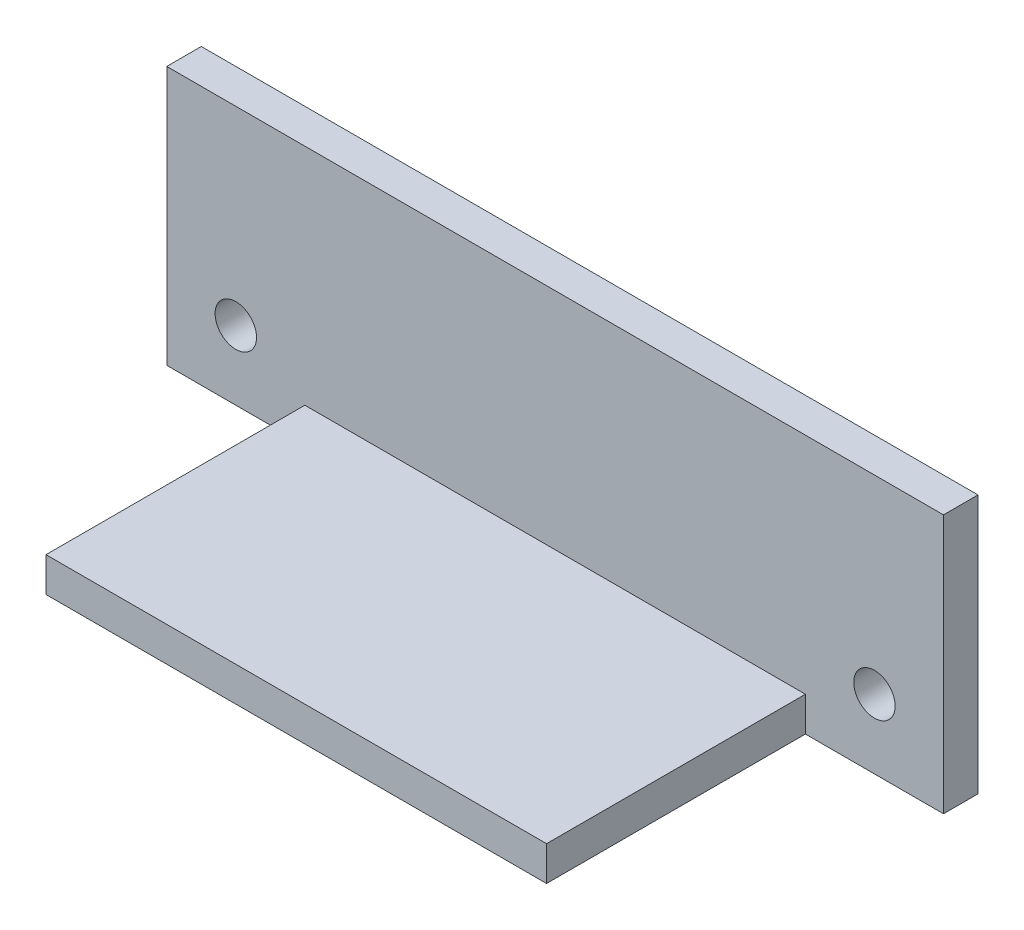
ISO-10303-21;
HEADER;
FILE_DESCRIPTION(('STEP AP214'),'2;1');
FILE_NAME('part.step','',(''),(''),'','','');
FILE_SCHEMA(('AUTOMOTIVE_DESIGN { 1 0 10303 214 1 1 1 1 }'));
ENDSEC;
DATA;
#1=APPLICATION_CONTEXT('core data for automotive mechanical design processes');
#2=APPLICATION_PROTOCOL_DEFINITION('international standard','automotive_design',2000,#1);
#3=PRODUCT_CONTEXT('',#1,'mechanical');
#4=PRODUCT('Part','Part','',(#3));
#5=PRODUCT_RELATED_PRODUCT_CATEGORY('part','',(#4));
#6=PRODUCT_DEFINITION_FORMATION('','',#4);
#7=PRODUCT_DEFINITION_CONTEXT('part definition',#1,'design');
#8=PRODUCT_DEFINITION('design','',#6,#7);
#9=PRODUCT_DEFINITION_SHAPE('','',#8);
#10=(LENGTH_UNIT() NAMED_UNIT(*) SI_UNIT(.MILLI.,.METRE.));
#11=(NAMED_UNIT(*) PLANE_ANGLE_UNIT() SI_UNIT($,.RADIAN.));
#12=(NAMED_UNIT(*) SI_UNIT($,.STERADIAN.) SOLID_ANGLE_UNIT());
#13=UNCERTAINTY_MEASURE_WITH_UNIT(LENGTH_MEASURE(1.E-05),#10,'distance_accuracy_value','');
#14=(GEOMETRIC_REPRESENTATION_CONTEXT(3) GLOBAL_UNCERTAINTY_ASSIGNED_CONTEXT((#13)) GLOBAL_UNIT_ASSIGNED_CONTEXT((#10,
#11,#12)) REPRESENTATION_CONTEXT('',''));
#15=CARTESIAN_POINT('',(0.,0.,0.));
#16=DIRECTION('',(0.,0.,1.));
#17=DIRECTION('',(1.,0.,0.));
#18=AXIS2_PLACEMENT_3D('',#15,#16,#17);
#19=CARTESIAN_POINT('',(-38.8972113815369,2.,0.));
#20=DIRECTION('',(1.,0.,0.));
#21=DIRECTION('',(0.,0.,-1.));
#22=AXIS2_PLACEMENT_3D('',#19,#20,#21);
#23=PLANE('',#22);
#24=DIRECTION('',(0.,0.,1.));
#25=VECTOR('',#24,1.);
#26=CARTESIAN_POINT('',(-38.8972113815369,2.,0.));
#27=LINE('',#26,#25);
#28=CARTESIAN_POINT('',(-38.8972113815369,2.,0.113319323773453));
#29=VERTEX_POINT('',#28);
#30=CARTESIAN_POINT('',(-38.8972113815369,2.,15.11));
#31=VERTEX_POINT('',#30);
#32=EDGE_CURVE('E175',#29,#31,#27,.T.);
#33=ORIENTED_EDGE('',*,*,#32,.F.);
#34=DIRECTION('',(0.,-1.,0.));
#35=VECTOR('',#34,1.);
#36=CARTESIAN_POINT('',(-38.8972113815369,2.,0.113319323773453));
#37=LINE('',#36,#35);
#38=CARTESIAN_POINT('',(-38.8972113815369,0.,0.113319323773453));
#39=VERTEX_POINT('',#38);
#40=EDGE_CURVE('E171',#29,#39,#37,.T.);
#41=ORIENTED_EDGE('',*,*,#40,.T.);
#42=DIRECTION('',(0.,0.,1.));
#43=VECTOR('',#42,1.);
#44=CARTESIAN_POINT('',(-38.8972113815369,0.,0.));
#45=LINE('',#44,#43);
#46=CARTESIAN_POINT('',(-38.8972113815369,0.,15.11));
#47=VERTEX_POINT('',#46);
#48=EDGE_CURVE('E174',#39,#47,#45,.T.);
#49=ORIENTED_EDGE('',*,*,#48,.T.);
#50=DIRECTION('',(0.,-1.,0.));
#51=VECTOR('',#50,1.);
#52=CARTESIAN_POINT('',(-38.8972113815369,2.,15.11));
#53=LINE('',#52,#51);
#54=EDGE_CURVE('E11',#31,#47,#53,.T.);
#55=ORIENTED_EDGE('',*,*,#54,.F.);
#56=EDGE_LOOP('',(#33,#41,#49,#55));
#57=FACE_BOUND('',#56,.T.);
#58=ADVANCED_FACE('F39',(#57),#23,.F.);
#59=CARTESIAN_POINT('',(-38.8972113815369,2.,15.11));
#60=DIRECTION('',(0.,0.,-1.));
#61=DIRECTION('',(-1.,0.,0.));
#62=AXIS2_PLACEMENT_3D('',#59,#60,#61);
#63=PLANE('',#62);
#64=DIRECTION('',(1.,0.,0.));
#65=VECTOR('',#64,1.);
#66=CARTESIAN_POINT('',(-38.8972113815369,0.,15.11));
#67=LINE('',#66,#65);
#68=CARTESIAN_POINT('',(-9.89721138153693,0.,15.11));
#69=VERTEX_POINT('',#68);
#70=EDGE_CURVE('E186',#47,#69,#67,.T.);
#71=ORIENTED_EDGE('',*,*,#70,.T.);
#72=DIRECTION('',(0.,-1.,0.));
#73=VECTOR('',#72,1.);
#74=CARTESIAN_POINT('',(-9.89721138153693,2.,15.11));
#75=LINE('',#74,#73);
#76=CARTESIAN_POINT('',(-9.89721138153693,2.,15.11));
#77=VERTEX_POINT('',#76);
#78=EDGE_CURVE('E47',#77,#69,#75,.T.);
#79=ORIENTED_EDGE('',*,*,#78,.F.);
#80=DIRECTION('',(1.,0.,0.));
#81=VECTOR('',#80,1.);
#82=CARTESIAN_POINT('',(-38.8972113815369,2.,15.11));
#83=LINE('',#82,#81);
#84=EDGE_CURVE('E178',#31,#77,#83,.T.);
#85=ORIENTED_EDGE('',*,*,#84,.F.);
#86=ORIENTED_EDGE('',*,*,#54,.T.);
#87=EDGE_LOOP('',(#71,#79,#85,#86));
#88=FACE_BOUND('',#87,.T.);
#89=ADVANCED_FACE('F242',(#88),#63,.F.);
#90=CARTESIAN_POINT('',(-9.89721138153693,2.,15.11));
#91=DIRECTION('',(-1.,0.,0.));
#92=DIRECTION('',(0.,0.,1.));
#93=AXIS2_PLACEMENT_3D('',#90,#91,#92);
#94=PLANE('',#93);
#95=DIRECTION('',(0.,0.,-1.));
#96=VECTOR('',#95,1.);
#97=CARTESIAN_POINT('',(-9.89721138153693,0.,15.11));
#98=LINE('',#97,#96);
#99=CARTESIAN_POINT('',(-9.89721138153693,0.,0.113319323773453));
#100=VERTEX_POINT('',#99);
#101=EDGE_CURVE('E62',#69,#100,#98,.T.);
#102=ORIENTED_EDGE('',*,*,#101,.T.);
#103=DIRECTION('',(0.,1.,0.));
#104=VECTOR('',#103,1.);
#105=CARTESIAN_POINT('',(-9.89721138153693,2.,0.113319323773453));
#106=LINE('',#105,#104);
#107=CARTESIAN_POINT('',(-9.89721138153693,2.,0.113319323773453));
#108=VERTEX_POINT('',#107);
#109=EDGE_CURVE('E168',#100,#108,#106,.T.);
#110=ORIENTED_EDGE('',*,*,#109,.T.);
#111=DIRECTION('',(0.,0.,-1.));
#112=VECTOR('',#111,1.);
#113=CARTESIAN_POINT('',(-9.89721138153693,2.,15.11));
#114=LINE('',#113,#112);
#115=EDGE_CURVE('E181',#77,#108,#114,.T.);
#116=ORIENTED_EDGE('',*,*,#115,.F.);
#117=ORIENTED_EDGE('',*,*,#78,.T.);
#118=EDGE_LOOP('',(#102,#110,#116,#117));
#119=FACE_BOUND('',#118,.T.);
#120=ADVANCED_FACE('F193',(#119),#94,.F.);
#121=CARTESIAN_POINT('',(0.,2.,0.));
#122=DIRECTION('',(0.,1.,0.));
#123=DIRECTION('',(0.,0.,1.));
#124=AXIS2_PLACEMENT_3D('',#121,#122,#123);
#125=PLANE('',#124);
#126=DIRECTION('',(1.,0.,0.));
#127=VECTOR('',#126,1.);
#128=CARTESIAN_POINT('',(0.,2.,0.113319323773453));
#129=LINE('',#128,#127);
#130=EDGE_CURVE('E54',#29,#108,#129,.T.);
#131=ORIENTED_EDGE('',*,*,#130,.F.);
#132=ORIENTED_EDGE('',*,*,#32,.T.);
#133=ORIENTED_EDGE('',*,*,#84,.T.);
#134=ORIENTED_EDGE('',*,*,#115,.T.);
#135=EDGE_LOOP('',(#131,#132,#133,#134));
#136=FACE_BOUND('',#135,.T.);
#137=ADVANCED_FACE('F237',(#136),#125,.T.);
#138=CARTESIAN_POINT('',(0.,0.,0.));
#139=DIRECTION('',(0.,1.,0.));
#140=DIRECTION('',(0.,0.,1.));
#141=AXIS2_PLACEMENT_3D('',#138,#139,#140);
#142=PLANE('',#141);
#143=ORIENTED_EDGE('',*,*,#48,.F.);
#144=DIRECTION('',(-1.,0.,0.));
#145=VECTOR('',#144,1.);
#146=CARTESIAN_POINT('',(-1.89721138153693,0.,0.113319323773453));
#147=LINE('',#146,#145);
#148=CARTESIAN_POINT('',(-46.8972113815369,0.,0.113319323773453));
#149=VERTEX_POINT('',#148);
#150=EDGE_CURVE('E152',#39,#149,#147,.T.);
#151=ORIENTED_EDGE('',*,*,#150,.T.);
#152=DIRECTION('',(0.,0.,-1.));
#153=VECTOR('',#152,1.);
#154=CARTESIAN_POINT('',(-46.8972113815369,0.,0.113319323773453));
#155=LINE('',#154,#153);
#156=CARTESIAN_POINT('',(-46.8972113815369,0.,-1.88668067622655));
#157=VERTEX_POINT('',#156);
#158=EDGE_CURVE('E112',#149,#157,#155,.T.);
#159=ORIENTED_EDGE('',*,*,#158,.T.);
#160=DIRECTION('',(-1.,0.,0.));
#161=VECTOR('',#160,1.);
#162=CARTESIAN_POINT('',(-1.89721138153693,0.,-1.88668067622655));
#163=LINE('',#162,#161);
#164=CARTESIAN_POINT('',(-1.89721138153693,0.,-1.88668067622655));
#165=VERTEX_POINT('',#164);
#166=EDGE_CURVE('E138',#165,#157,#163,.T.);
#167=ORIENTED_EDGE('',*,*,#166,.F.);
#168=DIRECTION('',(0.,0.,-1.));
#169=VECTOR('',#168,1.);
#170=CARTESIAN_POINT('',(-1.89721138153693,0.,0.113319323773453));
#171=LINE('',#170,#169);
#172=CARTESIAN_POINT('',(-1.89721138153693,0.,0.113319323773453));
#173=VERTEX_POINT('',#172);
#174=EDGE_CURVE('E135',#173,#165,#171,.T.);
#175=ORIENTED_EDGE('',*,*,#174,.F.);
#176=EDGE_CURVE('E148',#173,#100,#147,.T.);
#177=ORIENTED_EDGE('',*,*,#176,.T.);
#178=ORIENTED_EDGE('',*,*,#101,.F.);
#179=ORIENTED_EDGE('',*,*,#70,.F.);
#180=EDGE_LOOP('',(#143,#151,#159,#167,#175,#177,#178,#179));
#181=FACE_BOUND('',#180,.T.);
#182=ADVANCED_FACE('F199',(#181),#142,.F.);
#183=CARTESIAN_POINT('',(-1.89721138153693,15.,0.113319323773453));
#184=DIRECTION('',(0.,0.,1.));
#185=DIRECTION('',(1.,0.,0.));
#186=AXIS2_PLACEMENT_3D('',#183,#184,#185);
#187=PLANE('',#186);
#188=CARTESIAN_POINT('',(-5.89721138153693,4.,0.113319323773453));
#189=DIRECTION('',(0.,0.,1.));
#190=DIRECTION('',(1.,0.,0.));
#191=AXIS2_PLACEMENT_3D('',#188,#189,#190);
#192=CIRCLE('',#191,1.2);
#193=CARTESIAN_POINT('',(-4.69721138153693,4.,0.113319323773453));
#194=VERTEX_POINT('',#193);
#195=EDGE_CURVE('E217',#194,#194,#192,.T.);
#196=ORIENTED_EDGE('',*,*,#195,.F.);
#197=EDGE_LOOP('',(#196));
#198=FACE_BOUND('',#197,.T.);
#199=CARTESIAN_POINT('',(-42.8972113815369,4.,0.113319323773453));
#200=DIRECTION('',(0.,0.,1.));
#201=DIRECTION('',(1.,0.,0.));
#202=AXIS2_PLACEMENT_3D('',#199,#200,#201);
#203=CIRCLE('',#202,1.2);
#204=CARTESIAN_POINT('',(-41.6972113815369,4.,0.113319323773453));
#205=VERTEX_POINT('',#204);
#206=EDGE_CURVE('E207',#205,#205,#203,.T.);
#207=ORIENTED_EDGE('',*,*,#206,.F.);
#208=EDGE_LOOP('',(#207));
#209=FACE_BOUND('',#208,.T.);
#210=ORIENTED_EDGE('',*,*,#40,.F.);
#211=ORIENTED_EDGE('',*,*,#130,.T.);
#212=ORIENTED_EDGE('',*,*,#109,.F.);
#213=ORIENTED_EDGE('',*,*,#176,.F.);
#214=DIRECTION('',(0.,-1.,0.));
#215=VECTOR('',#214,1.);
#216=CARTESIAN_POINT('',(-1.89721138153693,15.,0.113319323773453));
#217=LINE('',#216,#215);
#218=CARTESIAN_POINT('',(-1.89721138153693,15.,0.113319323773453));
#219=VERTEX_POINT('',#218);
#220=EDGE_CURVE('E132',#219,#173,#217,.T.);
#221=ORIENTED_EDGE('',*,*,#220,.F.);
#222=DIRECTION('',(-1.,0.,0.));
#223=VECTOR('',#222,1.);
#224=CARTESIAN_POINT('',(-1.89721138153693,15.,0.113319323773453));
#225=LINE('',#224,#223);
#226=CARTESIAN_POINT('',(-46.8972113815369,15.,0.113319323773453));
#227=VERTEX_POINT('',#226);
#228=EDGE_CURVE('E123',#219,#227,#225,.T.);
#229=ORIENTED_EDGE('',*,*,#228,.T.);
#230=DIRECTION('',(0.,-1.,0.));
#231=VECTOR('',#230,1.);
#232=CARTESIAN_POINT('',(-46.8972113815369,15.,0.113319323773453));
#233=LINE('',#232,#231);
#234=EDGE_CURVE('E107',#227,#149,#233,.T.);
#235=ORIENTED_EDGE('',*,*,#234,.T.);
#236=ORIENTED_EDGE('',*,*,#150,.F.);
#237=EDGE_LOOP('',(#210,#211,#212,#213,#221,#229,#235,#236));
#238=FACE_BOUND('',#237,.T.);
#239=ADVANCED_FACE('F130',(#198,#209,#238),#187,.T.);
#240=CARTESIAN_POINT('',(-1.89721138153693,15.,0.113319323773453));
#241=DIRECTION('',(-1.,0.,0.));
#242=DIRECTION('',(0.,0.,1.));
#243=AXIS2_PLACEMENT_3D('',#240,#241,#242);
#244=PLANE('',#243);
#245=ORIENTED_EDGE('',*,*,#174,.T.);
#246=DIRECTION('',(0.,-1.,0.));
#247=VECTOR('',#246,1.);
#248=CARTESIAN_POINT('',(-1.89721138153693,15.,-1.88668067622655));
#249=LINE('',#248,#247);
#250=CARTESIAN_POINT('',(-1.89721138153693,15.,-1.88668067622655));
#251=VERTEX_POINT('',#250);
#252=EDGE_CURVE('E160',#251,#165,#249,.T.);
#253=ORIENTED_EDGE('',*,*,#252,.F.);
#254=DIRECTION('',(0.,0.,-1.));
#255=VECTOR('',#254,1.);
#256=CARTESIAN_POINT('',(-1.89721138153693,15.,0.113319323773453));
#257=LINE('',#256,#255);
#258=EDGE_CURVE('E118',#219,#251,#257,.T.);
#259=ORIENTED_EDGE('',*,*,#258,.F.);
#260=ORIENTED_EDGE('',*,*,#220,.T.);
#261=EDGE_LOOP('',(#245,#253,#259,#260));
#262=FACE_BOUND('',#261,.T.);
#263=ADVANCED_FACE('F228',(#262),#244,.F.);
#264=CARTESIAN_POINT('',(-1.89721138153693,15.,-1.88668067622655));
#265=DIRECTION('',(0.,0.,1.));
#266=DIRECTION('',(1.,0.,0.));
#267=AXIS2_PLACEMENT_3D('',#264,#265,#266);
#268=PLANE('',#267);
#269=CARTESIAN_POINT('',(-5.89721138153693,4.,-1.88668067622655));
#270=DIRECTION('',(0.,0.,1.));
#271=DIRECTION('',(1.,0.,0.));
#272=AXIS2_PLACEMENT_3D('',#269,#270,#271);
#273=CIRCLE('',#272,1.2);
#274=CARTESIAN_POINT('',(-4.69721138153693,4.,-1.88668067622655));
#275=VERTEX_POINT('',#274);
#276=EDGE_CURVE('E212',#275,#275,#273,.T.);
#277=ORIENTED_EDGE('',*,*,#276,.T.);
#278=EDGE_LOOP('',(#277));
#279=FACE_BOUND('',#278,.T.);
#280=CARTESIAN_POINT('',(-42.8972113815369,4.,-1.88668067622655));
#281=DIRECTION('',(0.,0.,1.));
#282=DIRECTION('',(1.,0.,0.));
#283=AXIS2_PLACEMENT_3D('',#280,#281,#282);
#284=CIRCLE('',#283,1.2);
#285=CARTESIAN_POINT('',(-41.6972113815369,4.,-1.88668067622655));
#286=VERTEX_POINT('',#285);
#287=EDGE_CURVE('E141',#286,#286,#284,.T.);
#288=ORIENTED_EDGE('',*,*,#287,.T.);
#289=EDGE_LOOP('',(#288));
#290=FACE_BOUND('',#289,.T.);
#291=ORIENTED_EDGE('',*,*,#166,.T.);
#292=DIRECTION('',(0.,-1.,0.));
#293=VECTOR('',#292,1.);
#294=CARTESIAN_POINT('',(-46.8972113815369,15.,-1.88668067622655));
#295=LINE('',#294,#293);
#296=CARTESIAN_POINT('',(-46.8972113815369,15.,-1.88668067622655));
#297=VERTEX_POINT('',#296);
#298=EDGE_CURVE('E117',#297,#157,#295,.T.);
#299=ORIENTED_EDGE('',*,*,#298,.F.);
#300=DIRECTION('',(-1.,0.,0.));
#301=VECTOR('',#300,1.);
#302=CARTESIAN_POINT('',(-1.89721138153693,15.,-1.88668067622655));
#303=LINE('',#302,#301);
#304=EDGE_CURVE('E125',#251,#297,#303,.T.);
#305=ORIENTED_EDGE('',*,*,#304,.F.);
#306=ORIENTED_EDGE('',*,*,#252,.T.);
#307=EDGE_LOOP('',(#291,#299,#305,#306));
#308=FACE_BOUND('',#307,.T.);
#309=ADVANCED_FACE('F234',(#279,#290,#308),#268,.F.);
#310=CARTESIAN_POINT('',(-46.8972113815369,15.,0.113319323773453));
#311=DIRECTION('',(-1.,0.,0.));
#312=DIRECTION('',(0.,0.,1.));
#313=AXIS2_PLACEMENT_3D('',#310,#311,#312);
#314=PLANE('',#313);
#315=ORIENTED_EDGE('',*,*,#158,.F.);
#316=ORIENTED_EDGE('',*,*,#234,.F.);
#317=DIRECTION('',(0.,0.,-1.));
#318=VECTOR('',#317,1.);
#319=CARTESIAN_POINT('',(-46.8972113815369,15.,0.113319323773453));
#320=LINE('',#319,#318);
#321=EDGE_CURVE('E110',#227,#297,#320,.T.);
#322=ORIENTED_EDGE('',*,*,#321,.T.);
#323=ORIENTED_EDGE('',*,*,#298,.T.);
#324=EDGE_LOOP('',(#315,#316,#322,#323));
#325=FACE_BOUND('',#324,.T.);
#326=ADVANCED_FACE('F109',(#325),#314,.T.);
#327=CARTESIAN_POINT('',(0.,15.,0.));
#328=DIRECTION('',(0.,-1.,0.));
#329=DIRECTION('',(0.,0.,-1.));
#330=AXIS2_PLACEMENT_3D('',#327,#328,#329);
#331=PLANE('',#330);
#332=ORIENTED_EDGE('',*,*,#228,.F.);
#333=ORIENTED_EDGE('',*,*,#258,.T.);
#334=ORIENTED_EDGE('',*,*,#304,.T.);
#335=ORIENTED_EDGE('',*,*,#321,.F.);
#336=EDGE_LOOP('',(#332,#333,#334,#335));
#337=FACE_BOUND('',#336,.T.);
#338=ADVANCED_FACE('F122',(#337),#331,.F.);
#339=CARTESIAN_POINT('',(-42.8972113815369,4.,0.113319323773453));
#340=DIRECTION('',(0.,0.,1.));
#341=DIRECTION('',(1.,0.,0.));
#342=AXIS2_PLACEMENT_3D('',#339,#340,#341);
#343=CYLINDRICAL_SURFACE('',#342,1.2);
#344=ORIENTED_EDGE('',*,*,#287,.F.);
#345=EDGE_LOOP('',(#344));
#346=FACE_BOUND('',#345,.T.);
#347=ORIENTED_EDGE('',*,*,#206,.T.);
#348=EDGE_LOOP('',(#347));
#349=FACE_BOUND('',#348,.T.);
#350=ADVANCED_FACE('F285',(#346,#349),#343,.F.);
#351=CARTESIAN_POINT('',(-5.89721138153693,4.,0.113319323773453));
#352=DIRECTION('',(0.,0.,1.));
#353=DIRECTION('',(1.,0.,0.));
#354=AXIS2_PLACEMENT_3D('',#351,#352,#353);
#355=CYLINDRICAL_SURFACE('',#354,1.2);
#356=ORIENTED_EDGE('',*,*,#276,.F.);
#357=EDGE_LOOP('',(#356));
#358=FACE_BOUND('',#357,.T.);
#359=ORIENTED_EDGE('',*,*,#195,.T.);
#360=EDGE_LOOP('',(#359));
#361=FACE_BOUND('',#360,.T.);
#362=ADVANCED_FACE('F224',(#358,#361),#355,.F.);
#363=CLOSED_SHELL('',(#58,#89,#120,#137,#182,#239,#263,#309,#326,#338,#350,#362));
#364=MANIFOLD_SOLID_BREP('B2',#363);
#365=ADVANCED_BREP_SHAPE_REPRESENTATION('',(#18,#364),#14);
#366=SHAPE_DEFINITION_REPRESENTATION(#9,#365);
ENDSEC;
END-ISO-10303-21;
